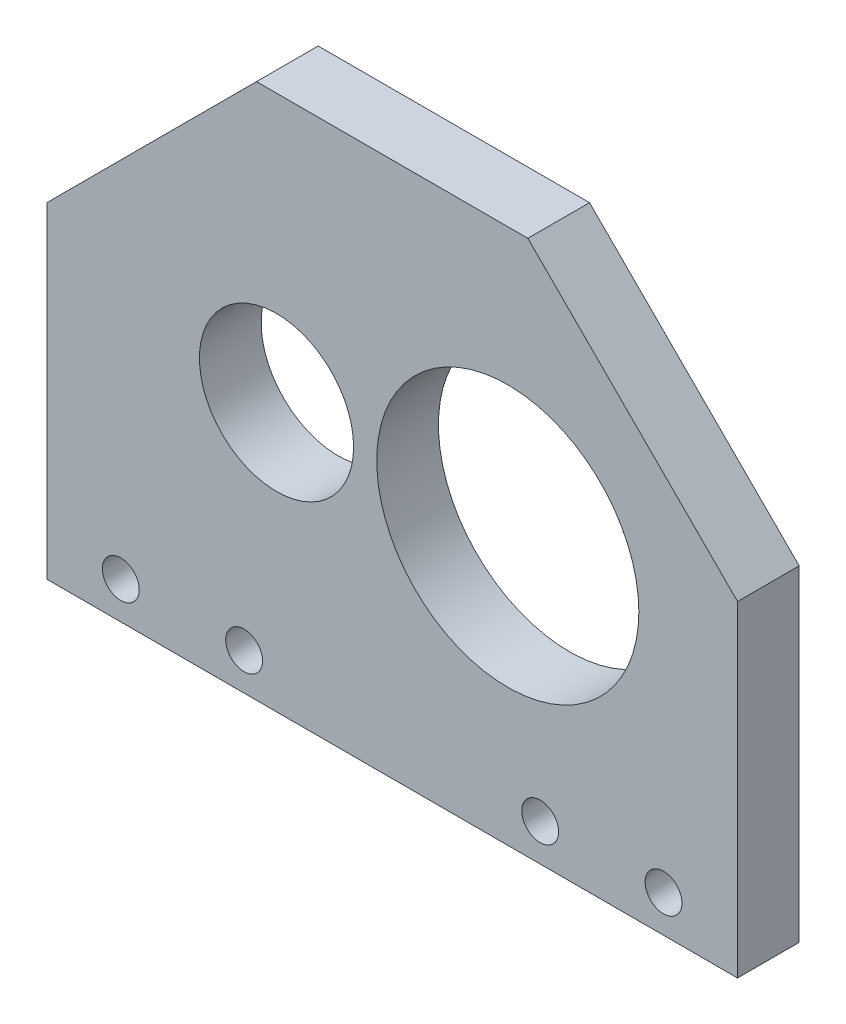
ISO-10303-21;
HEADER;
FILE_DESCRIPTION(('STEP AP214'),'2;1');
FILE_NAME('part.step','',(''),(''),'','','');
FILE_SCHEMA(('AUTOMOTIVE_DESIGN { 1 0 10303 214 1 1 1 1 }'));
ENDSEC;
DATA;
#1=APPLICATION_CONTEXT('core data for automotive mechanical design processes');
#2=APPLICATION_PROTOCOL_DEFINITION('international standard','automotive_design',2000,#1);
#3=PRODUCT_CONTEXT('',#1,'mechanical');
#4=PRODUCT('Part','Part','',(#3));
#5=PRODUCT_RELATED_PRODUCT_CATEGORY('part','',(#4));
#6=PRODUCT_DEFINITION_FORMATION('','',#4);
#7=PRODUCT_DEFINITION_CONTEXT('part definition',#1,'design');
#8=PRODUCT_DEFINITION('design','',#6,#7);
#9=PRODUCT_DEFINITION_SHAPE('','',#8);
#10=(LENGTH_UNIT() NAMED_UNIT(*) SI_UNIT(.MILLI.,.METRE.));
#11=(NAMED_UNIT(*) PLANE_ANGLE_UNIT() SI_UNIT($,.RADIAN.));
#12=(NAMED_UNIT(*) SI_UNIT($,.STERADIAN.) SOLID_ANGLE_UNIT());
#13=UNCERTAINTY_MEASURE_WITH_UNIT(LENGTH_MEASURE(1.E-05),#10,'distance_accuracy_value','');
#14=(GEOMETRIC_REPRESENTATION_CONTEXT(3) GLOBAL_UNCERTAINTY_ASSIGNED_CONTEXT((#13)) GLOBAL_UNIT_ASSIGNED_CONTEXT((#10,
#11,#12)) REPRESENTATION_CONTEXT('',''));
#15=CARTESIAN_POINT('',(0.,0.,0.));
#16=DIRECTION('',(0.,0.,1.));
#17=DIRECTION('',(1.,0.,0.));
#18=AXIS2_PLACEMENT_3D('',#15,#16,#17);
#19=CARTESIAN_POINT('',(0.,0.,6.35));
#20=DIRECTION('',(0.,0.,1.));
#21=DIRECTION('',(1.,0.,0.));
#22=AXIS2_PLACEMENT_3D('',#19,#20,#21);
#23=PLANE('',#22);
#24=DIRECTION('',(0.707106781186548,-0.707106781186548,0.));
#25=VECTOR('',#24,1.);
#26=CARTESIAN_POINT('',(35.56,5.99186000000002,6.35));
#27=LINE('',#26,#25);
#28=CARTESIAN_POINT('',(13.97,27.58186,6.35));
#29=VERTEX_POINT('',#28);
#30=CARTESIAN_POINT('',(35.56,5.99186000000002,6.35));
#31=VERTEX_POINT('',#30);
#32=EDGE_CURVE('E88',#29,#31,#27,.T.);
#33=ORIENTED_EDGE('',*,*,#32,.F.);
#34=DIRECTION('',(-1.,0.,0.));
#35=VECTOR('',#34,1.);
#36=CARTESIAN_POINT('',(35.56,27.58186,6.35));
#37=LINE('',#36,#35);
#38=CARTESIAN_POINT('',(-13.97,27.58186,6.35));
#39=VERTEX_POINT('',#38);
#40=EDGE_CURVE('E56',#29,#39,#37,.T.);
#41=ORIENTED_EDGE('',*,*,#40,.T.);
#42=DIRECTION('',(0.707106781186547,0.707106781186548,0.));
#43=VECTOR('',#42,1.);
#44=CARTESIAN_POINT('',(-35.56,5.99186000000001,6.35));
#45=LINE('',#44,#43);
#46=CARTESIAN_POINT('',(-35.56,5.99186000000001,6.35));
#47=VERTEX_POINT('',#46);
#48=EDGE_CURVE('E93',#47,#39,#45,.T.);
#49=ORIENTED_EDGE('',*,*,#48,.F.);
#50=DIRECTION('',(0.,-1.,0.));
#51=VECTOR('',#50,1.);
#52=CARTESIAN_POINT('',(-35.56,-27.58186,6.35));
#53=LINE('',#52,#51);
#54=CARTESIAN_POINT('',(-35.56,-27.58186,6.35));
#55=VERTEX_POINT('',#54);
#56=EDGE_CURVE('E111',#47,#55,#53,.T.);
#57=ORIENTED_EDGE('',*,*,#56,.T.);
#58=DIRECTION('',(1.,0.,0.));
#59=VECTOR('',#58,1.);
#60=CARTESIAN_POINT('',(35.56,-27.58186,6.35));
#61=LINE('',#60,#59);
#62=CARTESIAN_POINT('',(35.56,-27.58186,6.35));
#63=VERTEX_POINT('',#62);
#64=EDGE_CURVE('E118',#55,#63,#61,.T.);
#65=ORIENTED_EDGE('',*,*,#64,.T.);
#66=DIRECTION('',(0.,1.,0.));
#67=VECTOR('',#66,1.);
#68=CARTESIAN_POINT('',(35.56,-27.58186,6.35));
#69=LINE('',#68,#67);
#70=EDGE_CURVE('E116',#63,#31,#69,.T.);
#71=ORIENTED_EDGE('',*,*,#70,.T.);
#72=EDGE_LOOP('',(#33,#41,#49,#57,#65,#71));
#73=FACE_BOUND('',#72,.T.);
#74=CARTESIAN_POINT('',(-27.94,-23.77186,6.35));
#75=DIRECTION('',(0.,0.,1.));
#76=DIRECTION('',(1.,0.,0.));
#77=AXIS2_PLACEMENT_3D('',#74,#75,#76);
#78=CIRCLE('',#77,1.89864999999999);
#79=CARTESIAN_POINT('',(-26.04135,-23.77186,6.35));
#80=VERTEX_POINT('',#79);
#81=EDGE_CURVE('E154',#80,#80,#78,.T.);
#82=ORIENTED_EDGE('',*,*,#81,.F.);
#83=EDGE_LOOP('',(#82));
#84=FACE_BOUND('',#83,.T.);
#85=CARTESIAN_POINT('',(-15.24,-23.77186,6.35));
#86=DIRECTION('',(0.,0.,1.));
#87=DIRECTION('',(1.,0.,0.));
#88=AXIS2_PLACEMENT_3D('',#85,#86,#87);
#89=CIRCLE('',#88,1.89864999999999);
#90=CARTESIAN_POINT('',(-13.34135,-23.77186,6.35));
#91=VERTEX_POINT('',#90);
#92=EDGE_CURVE('E161',#91,#91,#89,.T.);
#93=ORIENTED_EDGE('',*,*,#92,.F.);
#94=EDGE_LOOP('',(#93));
#95=FACE_BOUND('',#94,.T.);
#96=CARTESIAN_POINT('',(15.24,-23.77186,6.35));
#97=DIRECTION('',(0.,0.,1.));
#98=DIRECTION('',(1.,0.,0.));
#99=AXIS2_PLACEMENT_3D('',#96,#97,#98);
#100=CIRCLE('',#99,1.89864999999999);
#101=CARTESIAN_POINT('',(17.13865,-23.77186,6.35));
#102=VERTEX_POINT('',#101);
#103=EDGE_CURVE('E167',#102,#102,#100,.T.);
#104=ORIENTED_EDGE('',*,*,#103,.F.);
#105=EDGE_LOOP('',(#104));
#106=FACE_BOUND('',#105,.T.);
#107=CARTESIAN_POINT('',(27.94,-23.77186,6.35));
#108=DIRECTION('',(0.,0.,1.));
#109=DIRECTION('',(1.,0.,0.));
#110=AXIS2_PLACEMENT_3D('',#107,#108,#109);
#111=CIRCLE('',#110,1.89864999999999);
#112=CARTESIAN_POINT('',(29.83865,-23.77186,6.35));
#113=VERTEX_POINT('',#112);
#114=EDGE_CURVE('E173',#113,#113,#111,.T.);
#115=ORIENTED_EDGE('',*,*,#114,.F.);
#116=EDGE_LOOP('',(#115));
#117=FACE_BOUND('',#116,.T.);
#118=CARTESIAN_POINT('',(11.90625,0.,6.35));
#119=DIRECTION('',(0.,0.,1.));
#120=DIRECTION('',(1.,0.,0.));
#121=AXIS2_PLACEMENT_3D('',#118,#119,#120);
#122=CIRCLE('',#121,13.49375);
#123=CARTESIAN_POINT('',(25.4,0.,6.35));
#124=VERTEX_POINT('',#123);
#125=EDGE_CURVE('E121',#124,#124,#122,.T.);
#126=ORIENTED_EDGE('',*,*,#125,.F.);
#127=EDGE_LOOP('',(#126));
#128=FACE_BOUND('',#127,.T.);
#129=CARTESIAN_POINT('',(-11.90625,0.,6.35));
#130=DIRECTION('',(0.,0.,1.));
#131=DIRECTION('',(1.,0.,0.));
#132=AXIS2_PLACEMENT_3D('',#129,#130,#131);
#133=CIRCLE('',#132,7.9375);
#134=CARTESIAN_POINT('',(-3.96875,0.,6.35));
#135=VERTEX_POINT('',#134);
#136=EDGE_CURVE('E132',#135,#135,#133,.T.);
#137=ORIENTED_EDGE('',*,*,#136,.F.);
#138=EDGE_LOOP('',(#137));
#139=FACE_BOUND('',#138,.T.);
#140=ADVANCED_FACE('F33',(#73,#84,#95,#106,#117,#128,#139),#23,.T.);
#141=CARTESIAN_POINT('',(0.,0.,0.));
#142=DIRECTION('',(0.,0.,1.));
#143=DIRECTION('',(1.,0.,0.));
#144=AXIS2_PLACEMENT_3D('',#141,#142,#143);
#145=PLANE('',#144);
#146=CARTESIAN_POINT('',(-27.94,-23.77186,0.));
#147=DIRECTION('',(0.,0.,1.));
#148=DIRECTION('',(1.,0.,0.));
#149=AXIS2_PLACEMENT_3D('',#146,#147,#148);
#150=CIRCLE('',#149,1.89864999999999);
#151=CARTESIAN_POINT('',(-26.04135,-23.77186,0.));
#152=VERTEX_POINT('',#151);
#153=EDGE_CURVE('E158',#152,#152,#150,.T.);
#154=ORIENTED_EDGE('',*,*,#153,.T.);
#155=EDGE_LOOP('',(#154));
#156=FACE_BOUND('',#155,.T.);
#157=CARTESIAN_POINT('',(-15.24,-23.77186,0.));
#158=DIRECTION('',(0.,0.,1.));
#159=DIRECTION('',(1.,0.,0.));
#160=AXIS2_PLACEMENT_3D('',#157,#158,#159);
#161=CIRCLE('',#160,1.89864999999999);
#162=CARTESIAN_POINT('',(-13.34135,-23.77186,0.));
#163=VERTEX_POINT('',#162);
#164=EDGE_CURVE('E164',#163,#163,#161,.T.);
#165=ORIENTED_EDGE('',*,*,#164,.T.);
#166=EDGE_LOOP('',(#165));
#167=FACE_BOUND('',#166,.T.);
#168=CARTESIAN_POINT('',(15.24,-23.77186,0.));
#169=DIRECTION('',(0.,0.,1.));
#170=DIRECTION('',(1.,0.,0.));
#171=AXIS2_PLACEMENT_3D('',#168,#169,#170);
#172=CIRCLE('',#171,1.89864999999999);
#173=CARTESIAN_POINT('',(17.13865,-23.77186,0.));
#174=VERTEX_POINT('',#173);
#175=EDGE_CURVE('E170',#174,#174,#172,.T.);
#176=ORIENTED_EDGE('',*,*,#175,.T.);
#177=EDGE_LOOP('',(#176));
#178=FACE_BOUND('',#177,.T.);
#179=CARTESIAN_POINT('',(27.94,-23.77186,0.));
#180=DIRECTION('',(0.,0.,1.));
#181=DIRECTION('',(1.,0.,0.));
#182=AXIS2_PLACEMENT_3D('',#179,#180,#181);
#183=CIRCLE('',#182,1.89864999999999);
#184=CARTESIAN_POINT('',(29.83865,-23.77186,0.));
#185=VERTEX_POINT('',#184);
#186=EDGE_CURVE('E176',#185,#185,#183,.T.);
#187=ORIENTED_EDGE('',*,*,#186,.T.);
#188=EDGE_LOOP('',(#187));
#189=FACE_BOUND('',#188,.T.);
#190=DIRECTION('',(-1.,0.,0.));
#191=VECTOR('',#190,1.);
#192=CARTESIAN_POINT('',(35.56,27.58186,0.));
#193=LINE('',#192,#191);
#194=CARTESIAN_POINT('',(13.97,27.58186,0.));
#195=VERTEX_POINT('',#194);
#196=CARTESIAN_POINT('',(-13.97,27.58186,0.));
#197=VERTEX_POINT('',#196);
#198=EDGE_CURVE('E104',#195,#197,#193,.T.);
#199=ORIENTED_EDGE('',*,*,#198,.F.);
#200=DIRECTION('',(0.707106781186548,-0.707106781186548,0.));
#201=VECTOR('',#200,1.);
#202=CARTESIAN_POINT('',(35.56,5.99186000000002,0.));
#203=LINE('',#202,#201);
#204=CARTESIAN_POINT('',(35.56,5.99186000000002,0.));
#205=VERTEX_POINT('',#204);
#206=EDGE_CURVE('E48',#195,#205,#203,.T.);
#207=ORIENTED_EDGE('',*,*,#206,.T.);
#208=DIRECTION('',(0.,1.,0.));
#209=VECTOR('',#208,1.);
#210=CARTESIAN_POINT('',(35.56,-27.58186,0.));
#211=LINE('',#210,#209);
#212=CARTESIAN_POINT('',(35.56,-27.58186,0.));
#213=VERTEX_POINT('',#212);
#214=EDGE_CURVE('E102',#213,#205,#211,.T.);
#215=ORIENTED_EDGE('',*,*,#214,.F.);
#216=DIRECTION('',(1.,0.,0.));
#217=VECTOR('',#216,1.);
#218=CARTESIAN_POINT('',(35.56,-27.58186,0.));
#219=LINE('',#218,#217);
#220=CARTESIAN_POINT('',(-35.56,-27.58186,0.));
#221=VERTEX_POINT('',#220);
#222=EDGE_CURVE('E109',#221,#213,#219,.T.);
#223=ORIENTED_EDGE('',*,*,#222,.F.);
#224=DIRECTION('',(0.,-1.,0.));
#225=VECTOR('',#224,1.);
#226=CARTESIAN_POINT('',(-35.56,-27.58186,0.));
#227=LINE('',#226,#225);
#228=CARTESIAN_POINT('',(-35.56,5.99186000000001,0.));
#229=VERTEX_POINT('',#228);
#230=EDGE_CURVE('E113',#229,#221,#227,.T.);
#231=ORIENTED_EDGE('',*,*,#230,.F.);
#232=DIRECTION('',(0.707106781186547,0.707106781186548,0.));
#233=VECTOR('',#232,1.);
#234=CARTESIAN_POINT('',(-35.56,5.99186000000001,0.));
#235=LINE('',#234,#233);
#236=EDGE_CURVE('E143',#229,#197,#235,.T.);
#237=ORIENTED_EDGE('',*,*,#236,.T.);
#238=EDGE_LOOP('',(#199,#207,#215,#223,#231,#237));
#239=FACE_BOUND('',#238,.T.);
#240=CARTESIAN_POINT('',(11.90625,0.,0.));
#241=DIRECTION('',(0.,0.,1.));
#242=DIRECTION('',(1.,0.,0.));
#243=AXIS2_PLACEMENT_3D('',#240,#241,#242);
#244=CIRCLE('',#243,13.49375);
#245=CARTESIAN_POINT('',(25.4,0.,0.));
#246=VERTEX_POINT('',#245);
#247=EDGE_CURVE('E127',#246,#246,#244,.T.);
#248=ORIENTED_EDGE('',*,*,#247,.T.);
#249=EDGE_LOOP('',(#248));
#250=FACE_BOUND('',#249,.T.);
#251=CARTESIAN_POINT('',(-11.90625,0.,0.));
#252=DIRECTION('',(0.,0.,1.));
#253=DIRECTION('',(1.,0.,0.));
#254=AXIS2_PLACEMENT_3D('',#251,#252,#253);
#255=CIRCLE('',#254,7.9375);
#256=CARTESIAN_POINT('',(-3.96875,0.,0.));
#257=VERTEX_POINT('',#256);
#258=EDGE_CURVE('E135',#257,#257,#255,.T.);
#259=ORIENTED_EDGE('',*,*,#258,.T.);
#260=EDGE_LOOP('',(#259));
#261=FACE_BOUND('',#260,.T.);
#262=ADVANCED_FACE('F99',(#156,#167,#178,#189,#239,#250,#261),#145,.F.);
#263=CARTESIAN_POINT('',(-35.56,-27.58186,6.35));
#264=DIRECTION('',(1.,0.,0.));
#265=DIRECTION('',(0.,0.,-1.));
#266=AXIS2_PLACEMENT_3D('',#263,#264,#265);
#267=PLANE('',#266);
#268=ORIENTED_EDGE('',*,*,#56,.F.);
#269=DIRECTION('',(0.,0.,1.));
#270=VECTOR('',#269,1.);
#271=CARTESIAN_POINT('',(-35.56,5.99186000000001,0.));
#272=LINE('',#271,#270);
#273=EDGE_CURVE('E146',#229,#47,#272,.T.);
#274=ORIENTED_EDGE('',*,*,#273,.F.);
#275=ORIENTED_EDGE('',*,*,#230,.T.);
#276=DIRECTION('',(0.,0.,-1.));
#277=VECTOR('',#276,1.);
#278=CARTESIAN_POINT('',(-35.56,-27.58186,6.35));
#279=LINE('',#278,#277);
#280=EDGE_CURVE('E11',#55,#221,#279,.T.);
#281=ORIENTED_EDGE('',*,*,#280,.F.);
#282=EDGE_LOOP('',(#268,#274,#275,#281));
#283=FACE_BOUND('',#282,.T.);
#284=ADVANCED_FACE('F35',(#283),#267,.F.);
#285=CARTESIAN_POINT('',(35.56,-27.58186,6.35));
#286=DIRECTION('',(0.,1.,0.));
#287=DIRECTION('',(-1.,0.,0.));
#288=AXIS2_PLACEMENT_3D('',#285,#286,#287);
#289=PLANE('',#288);
#290=ORIENTED_EDGE('',*,*,#222,.T.);
#291=DIRECTION('',(0.,0.,-1.));
#292=VECTOR('',#291,1.);
#293=CARTESIAN_POINT('',(35.56,-27.58186,6.35));
#294=LINE('',#293,#292);
#295=EDGE_CURVE('E41',#63,#213,#294,.T.);
#296=ORIENTED_EDGE('',*,*,#295,.F.);
#297=ORIENTED_EDGE('',*,*,#64,.F.);
#298=ORIENTED_EDGE('',*,*,#280,.T.);
#299=EDGE_LOOP('',(#290,#296,#297,#298));
#300=FACE_BOUND('',#299,.T.);
#301=ADVANCED_FACE('F142',(#300),#289,.F.);
#302=CARTESIAN_POINT('',(35.56,-27.58186,6.35));
#303=DIRECTION('',(-1.,0.,0.));
#304=DIRECTION('',(0.,0.,1.));
#305=AXIS2_PLACEMENT_3D('',#302,#303,#304);
#306=PLANE('',#305);
#307=ORIENTED_EDGE('',*,*,#214,.T.);
#308=DIRECTION('',(0.,0.,1.));
#309=VECTOR('',#308,1.);
#310=CARTESIAN_POINT('',(35.56,5.99186000000002,0.));
#311=LINE('',#310,#309);
#312=EDGE_CURVE('E86',#205,#31,#311,.T.);
#313=ORIENTED_EDGE('',*,*,#312,.T.);
#314=ORIENTED_EDGE('',*,*,#70,.F.);
#315=ORIENTED_EDGE('',*,*,#295,.T.);
#316=EDGE_LOOP('',(#307,#313,#314,#315));
#317=FACE_BOUND('',#316,.T.);
#318=ADVANCED_FACE('F107',(#317),#306,.F.);
#319=CARTESIAN_POINT('',(35.56,27.58186,6.35));
#320=DIRECTION('',(0.,-1.,0.));
#321=DIRECTION('',(1.,0.,0.));
#322=AXIS2_PLACEMENT_3D('',#319,#320,#321);
#323=PLANE('',#322);
#324=ORIENTED_EDGE('',*,*,#40,.F.);
#325=DIRECTION('',(0.,0.,1.));
#326=VECTOR('',#325,1.);
#327=CARTESIAN_POINT('',(13.97,27.58186,0.));
#328=LINE('',#327,#326);
#329=EDGE_CURVE('E94',#195,#29,#328,.T.);
#330=ORIENTED_EDGE('',*,*,#329,.F.);
#331=ORIENTED_EDGE('',*,*,#198,.T.);
#332=DIRECTION('',(0.,0.,1.));
#333=VECTOR('',#332,1.);
#334=CARTESIAN_POINT('',(-13.97,27.58186,0.));
#335=LINE('',#334,#333);
#336=EDGE_CURVE('E148',#197,#39,#335,.T.);
#337=ORIENTED_EDGE('',*,*,#336,.T.);
#338=EDGE_LOOP('',(#324,#330,#331,#337));
#339=FACE_BOUND('',#338,.T.);
#340=ADVANCED_FACE('F197',(#339),#323,.F.);
#341=CARTESIAN_POINT('',(11.90625,0.,6.35));
#342=DIRECTION('',(0.,0.,-1.));
#343=DIRECTION('',(-1.,0.,0.));
#344=AXIS2_PLACEMENT_3D('',#341,#342,#343);
#345=CYLINDRICAL_SURFACE('',#344,13.49375);
#346=ORIENTED_EDGE('',*,*,#125,.T.);
#347=EDGE_LOOP('',(#346));
#348=FACE_BOUND('',#347,.T.);
#349=ORIENTED_EDGE('',*,*,#247,.F.);
#350=EDGE_LOOP('',(#349));
#351=FACE_BOUND('',#350,.T.);
#352=ADVANCED_FACE('F188',(#348,#351),#345,.F.);
#353=CARTESIAN_POINT('',(-11.90625,0.,6.35));
#354=DIRECTION('',(0.,0.,-1.));
#355=DIRECTION('',(-1.,0.,0.));
#356=AXIS2_PLACEMENT_3D('',#353,#354,#355);
#357=CYLINDRICAL_SURFACE('',#356,7.9375);
#358=ORIENTED_EDGE('',*,*,#136,.T.);
#359=EDGE_LOOP('',(#358));
#360=FACE_BOUND('',#359,.T.);
#361=ORIENTED_EDGE('',*,*,#258,.F.);
#362=EDGE_LOOP('',(#361));
#363=FACE_BOUND('',#362,.T.);
#364=ADVANCED_FACE('F185',(#360,#363),#357,.F.);
#365=CARTESIAN_POINT('',(27.94,-23.77186,6.35));
#366=DIRECTION('',(0.,0.,1.));
#367=DIRECTION('',(1.,0.,0.));
#368=AXIS2_PLACEMENT_3D('',#365,#366,#367);
#369=CYLINDRICAL_SURFACE('',#368,1.89864999999999);
#370=ORIENTED_EDGE('',*,*,#186,.F.);
#371=EDGE_LOOP('',(#370));
#372=FACE_BOUND('',#371,.T.);
#373=ORIENTED_EDGE('',*,*,#114,.T.);
#374=EDGE_LOOP('',(#373));
#375=FACE_BOUND('',#374,.T.);
#376=ADVANCED_FACE('F187',(#372,#375),#369,.F.);
#377=CARTESIAN_POINT('',(15.24,-23.77186,6.35));
#378=DIRECTION('',(0.,0.,1.));
#379=DIRECTION('',(1.,0.,0.));
#380=AXIS2_PLACEMENT_3D('',#377,#378,#379);
#381=CYLINDRICAL_SURFACE('',#380,1.89864999999999);
#382=ORIENTED_EDGE('',*,*,#175,.F.);
#383=EDGE_LOOP('',(#382));
#384=FACE_BOUND('',#383,.T.);
#385=ORIENTED_EDGE('',*,*,#103,.T.);
#386=EDGE_LOOP('',(#385));
#387=FACE_BOUND('',#386,.T.);
#388=ADVANCED_FACE('F194',(#384,#387),#381,.F.);
#389=CARTESIAN_POINT('',(-15.24,-23.77186,6.35));
#390=DIRECTION('',(0.,0.,1.));
#391=DIRECTION('',(1.,0.,0.));
#392=AXIS2_PLACEMENT_3D('',#389,#390,#391);
#393=CYLINDRICAL_SURFACE('',#392,1.89864999999999);
#394=ORIENTED_EDGE('',*,*,#164,.F.);
#395=EDGE_LOOP('',(#394));
#396=FACE_BOUND('',#395,.T.);
#397=ORIENTED_EDGE('',*,*,#92,.T.);
#398=EDGE_LOOP('',(#397));
#399=FACE_BOUND('',#398,.T.);
#400=ADVANCED_FACE('F227',(#396,#399),#393,.F.);
#401=CARTESIAN_POINT('',(-27.94,-23.77186,6.35));
#402=DIRECTION('',(0.,0.,1.));
#403=DIRECTION('',(1.,0.,0.));
#404=AXIS2_PLACEMENT_3D('',#401,#402,#403);
#405=CYLINDRICAL_SURFACE('',#404,1.89864999999999);
#406=ORIENTED_EDGE('',*,*,#153,.F.);
#407=EDGE_LOOP('',(#406));
#408=FACE_BOUND('',#407,.T.);
#409=ORIENTED_EDGE('',*,*,#81,.T.);
#410=EDGE_LOOP('',(#409));
#411=FACE_BOUND('',#410,.T.);
#412=ADVANCED_FACE('F220',(#408,#411),#405,.F.);
#413=CARTESIAN_POINT('',(-35.56,5.99186000000001,0.));
#414=DIRECTION('',(0.707106781186548,-0.707106781186547,0.));
#415=DIRECTION('',(0.707106781186547,0.707106781186548,0.));
#416=AXIS2_PLACEMENT_3D('',#413,#414,#415);
#417=PLANE('',#416);
#418=ORIENTED_EDGE('',*,*,#48,.T.);
#419=ORIENTED_EDGE('',*,*,#336,.F.);
#420=ORIENTED_EDGE('',*,*,#236,.F.);
#421=ORIENTED_EDGE('',*,*,#273,.T.);
#422=EDGE_LOOP('',(#418,#419,#420,#421));
#423=FACE_BOUND('',#422,.T.);
#424=ADVANCED_FACE('F217',(#423),#417,.F.);
#425=CARTESIAN_POINT('',(35.56,5.99186000000002,0.));
#426=DIRECTION('',(-0.707106781186547,-0.707106781186548,0.));
#427=DIRECTION('',(0.707106781186548,-0.707106781186547,0.));
#428=AXIS2_PLACEMENT_3D('',#425,#426,#427);
#429=PLANE('',#428);
#430=ORIENTED_EDGE('',*,*,#32,.T.);
#431=ORIENTED_EDGE('',*,*,#312,.F.);
#432=ORIENTED_EDGE('',*,*,#206,.F.);
#433=ORIENTED_EDGE('',*,*,#329,.T.);
#434=EDGE_LOOP('',(#430,#431,#432,#433));
#435=FACE_BOUND('',#434,.T.);
#436=ADVANCED_FACE('F87',(#435),#429,.F.);
#437=CLOSED_SHELL('',(#140,#262,#284,#301,#318,#340,#352,#364,#376,#388,#400,#412,#424,#436));
#438=MANIFOLD_SOLID_BREP('B2',#437);
#439=ADVANCED_BREP_SHAPE_REPRESENTATION('',(#18,#438),#14);
#440=SHAPE_DEFINITION_REPRESENTATION(#9,#439);
ENDSEC;
END-ISO-10303-21;
